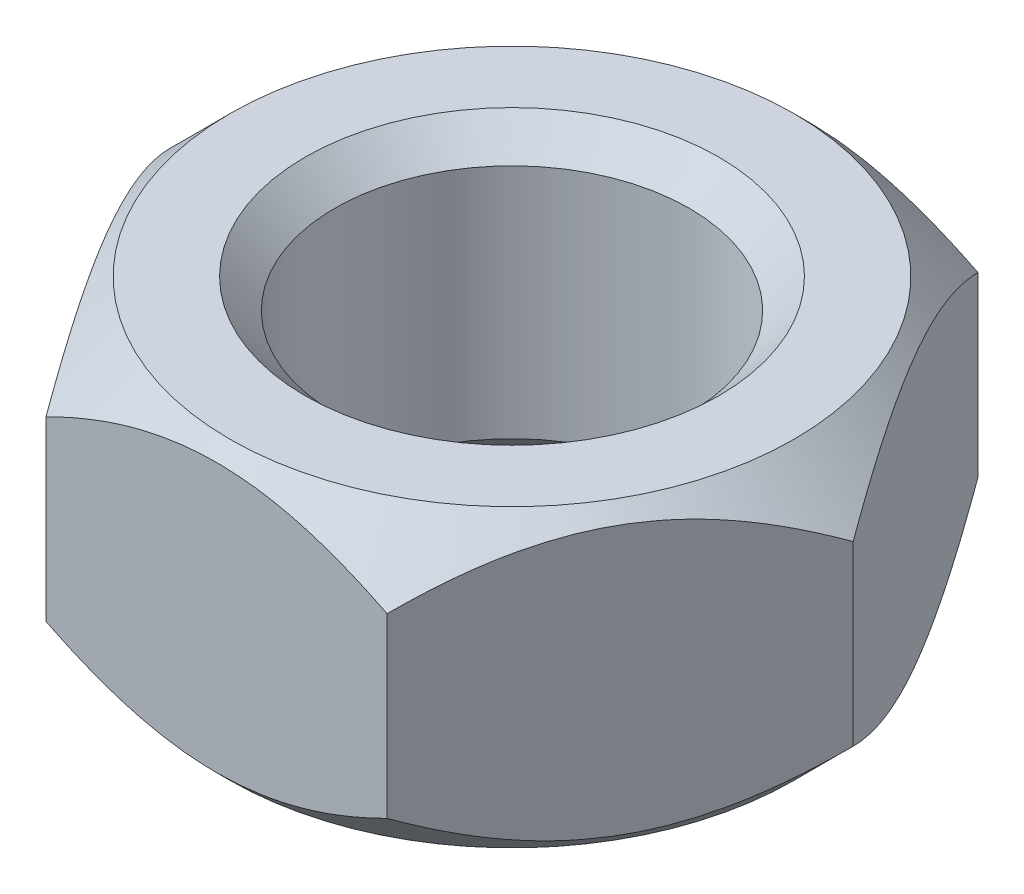
ISO-10303-21;
HEADER;
FILE_DESCRIPTION(('STEP AP214'),'2;1');
FILE_NAME('part.step','',(''),(''),'','','');
FILE_SCHEMA(('AUTOMOTIVE_DESIGN { 1 0 10303 214 1 1 1 1 }'));
ENDSEC;
DATA;
#1=APPLICATION_CONTEXT('core data for automotive mechanical design processes');
#2=APPLICATION_PROTOCOL_DEFINITION('international standard','automotive_design',2000,#1);
#3=PRODUCT_CONTEXT('',#1,'mechanical');
#4=PRODUCT('Part','Part','',(#3));
#5=PRODUCT_RELATED_PRODUCT_CATEGORY('part','',(#4));
#6=PRODUCT_DEFINITION_FORMATION('','',#4);
#7=PRODUCT_DEFINITION_CONTEXT('part definition',#1,'design');
#8=PRODUCT_DEFINITION('design','',#6,#7);
#9=PRODUCT_DEFINITION_SHAPE('','',#8);
#10=(LENGTH_UNIT() NAMED_UNIT(*) SI_UNIT(.MILLI.,.METRE.));
#11=(NAMED_UNIT(*) PLANE_ANGLE_UNIT() SI_UNIT($,.RADIAN.));
#12=(NAMED_UNIT(*) SI_UNIT($,.STERADIAN.) SOLID_ANGLE_UNIT());
#13=UNCERTAINTY_MEASURE_WITH_UNIT(LENGTH_MEASURE(1.E-05),#10,'distance_accuracy_value','');
#14=(GEOMETRIC_REPRESENTATION_CONTEXT(3) GLOBAL_UNCERTAINTY_ASSIGNED_CONTEXT((#13)) GLOBAL_UNIT_ASSIGNED_CONTEXT((#10,
#11,#12)) REPRESENTATION_CONTEXT('',''));
#15=CARTESIAN_POINT('',(0.,0.,0.));
#16=DIRECTION('',(0.,0.,1.));
#17=DIRECTION('',(1.,0.,0.));
#18=AXIS2_PLACEMENT_3D('',#15,#16,#17);
#19=CARTESIAN_POINT('',(-5.77350269189627,-5.,0.));
#20=DIRECTION('',(-0.86602540378444,0.,-0.499999999999998));
#21=DIRECTION('',(-0.499999999999998,0.,0.86602540378444));
#22=AXIS2_PLACEMENT_3D('',#19,#20,#21);
#23=PLANE('',#22);
#24=CARTESIAN_POINT('',(-5.77361816195011,-3.99988452648213,0.000200000000033862));
#25=CARTESIAN_POINT('',(-5.72398176110227,-4.04951645439574,-0.085772768173274));
#26=CARTESIAN_POINT('',(-5.67396382807172,-4.0976252747131,-0.172406369471776));
#27=CARTESIAN_POINT('',(-5.57309004377305,-4.19033336867022,-0.347124889028807));
#28=CARTESIAN_POINT('',(-5.52223375293571,-4.23493072549852,-0.435210568643578));
#29=CARTESIAN_POINT('',(-5.36782257743901,-4.36314092787175,-0.702658569860301));
#30=CARTESIAN_POINT('',(-5.26296050943973,-4.44062493449849,-0.884284999421801));
#31=CARTESIAN_POINT('',(-5.05149774994708,-4.57331105557449,-1.2505492427718));
#32=CARTESIAN_POINT('',(-4.94495110937144,-4.62884745935417,-1.43509343762458));
#33=CARTESIAN_POINT('',(-4.78337944338748,-4.69308950595249,-1.71494377217235));
#34=CARTESIAN_POINT('',(-4.72928433986569,-4.71131783666137,-1.80863923991278));
#35=CARTESIAN_POINT('',(-4.62063609179561,-4.74100781287389,-1.99682352572351));
#36=CARTESIAN_POINT('',(-4.56608301694087,-4.75247046969493,-2.09131222308103));
#37=CARTESIAN_POINT('',(-4.43314578685874,-4.77168913825403,-2.32156625980076));
#38=CARTESIAN_POINT('',(-4.35461839928599,-4.7757217117403,-2.45757968486241));
#39=CARTESIAN_POINT('',(-4.19770514602326,-4.7689541458947,-2.72936141189438));
#40=CARTESIAN_POINT('',(-4.1193193395861,-4.75814880702901,-2.8651296112358));
#41=CARTESIAN_POINT('',(-3.96328672226452,-4.72234235010198,-3.13538603207473));
#42=CARTESIAN_POINT('',(-3.88564083675505,-4.69732535604175,-3.26987265077582));
#43=CARTESIAN_POINT('',(-3.73168360440636,-4.63445567501058,-3.53653439939644));
#44=CARTESIAN_POINT('',(-3.65537215571137,-4.59660397223245,-3.66870970573535));
#45=CARTESIAN_POINT('',(-3.51990355411978,-4.51873011323948,-3.90334820652229));
#46=CARTESIAN_POINT('',(-3.46044647368861,-4.480755749581,-4.00633089069878));
#47=CARTESIAN_POINT('',(-3.34259967462163,-4.39868737382607,-4.21044753419216));
#48=CARTESIAN_POINT('',(-3.28420998845895,-4.35459317589646,-4.31158143726391));
#49=CARTESIAN_POINT('',(-3.16868188148909,-4.26127361464765,-4.51168198823797));
#50=CARTESIAN_POINT('',(-3.11154017495449,-4.21206438729062,-4.61065432718708));
#51=CARTESIAN_POINT('',(-2.99831490663732,-4.109160877157,-4.80676624461304));
#52=CARTESIAN_POINT('',(-2.9422307213283,-4.05546934545099,-4.90390690306938));
#53=CARTESIAN_POINT('',(-2.8866358758943,-3.99988452648214,-5.0002));
#54=B_SPLINE_CURVE_WITH_KNOTS('',3,(#24,#25,#26,#27,#28,#29,#30,#31,#32,#33,#34,#35,#36,#37,#38,
#39,#40,#41,#42,#43,#44,#45,#46,#47,#48,#49,#50,#51,#52,#53),.UNSPECIFIED.,.F.,.F.,(4,2,2,2,2,2,
2,2,2,2,2,2,2,2,4),(0.,0.33294561620957,0.666071736106995,1.33592065243335,1.99513262597483,
2.32409207808826,2.65300234563692,3.12358963991985,3.59434188052355,4.06562104077028,
4.53686407049612,4.91117956742318,5.28550643319672,5.65868635377118,6.03163889109476),.UNSPECIFIED.);
#55=CARTESIAN_POINT('',(-5.77350269189627,-4.,0.));
#56=VERTEX_POINT('',#55);
#57=CARTESIAN_POINT('',(-2.88675134594815,-4.,-5.));
#58=VERTEX_POINT('',#57);
#59=EDGE_CURVE('E156',#56,#58,#54,.T.);
#60=ORIENTED_EDGE('',*,*,#59,.F.);
#61=DIRECTION('',(0.,1.,0.));
#62=VECTOR('',#61,1.);
#63=CARTESIAN_POINT('',(-5.77350269189627,-5.,0.));
#64=LINE('',#63,#62);
#65=CARTESIAN_POINT('',(-5.77350269189627,-1.,0.));
#66=VERTEX_POINT('',#65);
#67=EDGE_CURVE('E52',#56,#66,#64,.T.);
#68=ORIENTED_EDGE('',*,*,#67,.T.);
#69=CARTESIAN_POINT('',(-2.8866358758943,-1.00011547351786,-5.0002));
#70=CARTESIAN_POINT('',(-2.93627227674214,-0.950483545604252,-4.91422723182669));
#71=CARTESIAN_POINT('',(-2.98629020977269,-0.902374725286896,-4.82759363052819));
#72=CARTESIAN_POINT('',(-3.08716399407136,-0.809666631329771,-4.65287511097116));
#73=CARTESIAN_POINT('',(-3.13802028490869,-0.765069274501478,-4.56478943135639));
#74=CARTESIAN_POINT('',(-3.2924314604054,-0.636859072128247,-4.29734143013967));
#75=CARTESIAN_POINT('',(-3.39729352840468,-0.559375065501511,-4.11571500057817));
#76=CARTESIAN_POINT('',(-3.60875628789733,-0.426688944425507,-3.74945075722818));
#77=CARTESIAN_POINT('',(-3.71530292847297,-0.371152540645827,-3.56490656237539));
#78=CARTESIAN_POINT('',(-3.87687459445693,-0.306910494047508,-3.28505622782762));
#79=CARTESIAN_POINT('',(-3.93096969797871,-0.288682163338627,-3.1913607600872));
#80=CARTESIAN_POINT('',(-4.03961794604879,-0.258992187126111,-3.00317647427647));
#81=CARTESIAN_POINT('',(-4.09417102090353,-0.247529530305074,-2.90868777691895));
#82=CARTESIAN_POINT('',(-4.22710825098566,-0.228310861745971,-2.67843374019922));
#83=CARTESIAN_POINT('',(-4.30563563855841,-0.224278288259701,-2.54242031513757));
#84=CARTESIAN_POINT('',(-4.46254889182114,-0.231045854105299,-2.2706385881056));
#85=CARTESIAN_POINT('',(-4.5409346982583,-0.241851192970986,-2.13487038876418));
#86=CARTESIAN_POINT('',(-4.69696731557988,-0.277657649898026,-1.86461396792525));
#87=CARTESIAN_POINT('',(-4.77461320108935,-0.30267464395825,-1.73012734922416));
#88=CARTESIAN_POINT('',(-4.92857043343805,-0.365544324989421,-1.46346560060354));
#89=CARTESIAN_POINT('',(-5.00488188213303,-0.403396027767547,-1.33129029426463));
#90=CARTESIAN_POINT('',(-5.14035048372463,-0.481269886760525,-1.09665179347769));
#91=CARTESIAN_POINT('',(-5.19980756415579,-0.519244250419006,-0.993669109301201));
#92=CARTESIAN_POINT('',(-5.31765436322278,-0.601312626173936,-0.789552465807819));
#93=CARTESIAN_POINT('',(-5.37604404938545,-0.645406824103543,-0.688418562736068));
#94=CARTESIAN_POINT('',(-5.49157215635532,-0.738726385352353,-0.488318011762007));
#95=CARTESIAN_POINT('',(-5.54871386288992,-0.787935612709386,-0.389345672812888));
#96=CARTESIAN_POINT('',(-5.66193913120709,-0.890839122843004,-0.19323375538693));
#97=CARTESIAN_POINT('',(-5.71802331651611,-0.94453065454902,-0.0960930969305876));
#98=CARTESIAN_POINT('',(-5.77361816195011,-1.00011547351787,0.00020000000003385));
#99=B_SPLINE_CURVE_WITH_KNOTS('',3,(#69,#70,#71,#72,#73,#74,#75,#76,#77,#78,#79,#80,#81,#82,#83,
#84,#85,#86,#87,#88,#89,#90,#91,#92,#93,#94,#95,#96,#97,#98),.UNSPECIFIED.,.F.,.F.,(4,2,2,2,2,2,
2,2,2,2,2,2,2,2,4),(0.,0.332945616209568,0.666071736106989,1.33592065243334,1.99513262597481,
2.32409207808824,2.65300234563691,3.12358963991983,3.59434188052353,4.06562104077026,
4.5368640704961,4.91117956742317,5.28550643319671,5.65868635377117,6.03163889109476),.UNSPECIFIED.);
#100=CARTESIAN_POINT('',(-2.88675134594815,-1.,-5.));
#101=VERTEX_POINT('',#100);
#102=EDGE_CURVE('E112',#101,#66,#99,.T.);
#103=ORIENTED_EDGE('',*,*,#102,.F.);
#104=DIRECTION('',(0.,1.,0.));
#105=VECTOR('',#104,1.);
#106=CARTESIAN_POINT('',(-2.88675134594814,-5.,-5.));
#107=LINE('',#106,#105);
#108=EDGE_CURVE('E117',#58,#101,#107,.T.);
#109=ORIENTED_EDGE('',*,*,#108,.F.);
#110=EDGE_LOOP('',(#60,#68,#103,#109));
#111=FACE_BOUND('',#110,.T.);
#112=ADVANCED_FACE('F29',(#111),#23,.T.);
#113=CARTESIAN_POINT('',(-2.88675134594814,-5.,-5.));
#114=DIRECTION('',(0.,0.,-1.));
#115=DIRECTION('',(-1.,0.,0.));
#116=AXIS2_PLACEMENT_3D('',#113,#114,#115);
#117=PLANE('',#116);
#118=CARTESIAN_POINT('',(-5.93336867910427,-2.01432336144028,-5.));
#119=CARTESIAN_POINT('',(-5.78966341948591,-2.12418858178788,-5.));
#120=CARTESIAN_POINT('',(-5.64517359422459,-2.23304389822758,-5.));
#121=CARTESIAN_POINT('',(-5.35430787651164,-2.44827641705776,-5.));
#122=CARTESIAN_POINT('',(-5.2079315372339,-2.55465301495843,-5.));
#123=CARTESIAN_POINT('',(-4.91190536107514,-2.76522692025995,-5.));
#124=CARTESIAN_POINT('',(-4.76223896743824,-2.86940102910426,-5.));
#125=CARTESIAN_POINT('',(-4.46039793019073,-3.07403749362641,-5.));
#126=CARTESIAN_POINT('',(-4.30822346176154,-3.17450010696542,-5.));
#127=CARTESIAN_POINT('',(-3.99153933620169,-3.37689028562684,-5.));
#128=CARTESIAN_POINT('',(-3.82684512877717,-3.47853053625135,-5.));
#129=CARTESIAN_POINT('',(-3.49359569305954,-3.67537782448447,-5.));
#130=CARTESIAN_POINT('',(-3.32503983391763,-3.77058380079454,-5.));
#131=CARTESIAN_POINT('',(-2.98404180965615,-3.95252582018176,-5.));
#132=CARTESIAN_POINT('',(-2.81161302726994,-4.03928674909056,-5.));
#133=CARTESIAN_POINT('',(-2.46193775088612,-4.20239520740955,-5.));
#134=CARTESIAN_POINT('',(-2.2846935457348,-4.27874758379917,-5.));
#135=CARTESIAN_POINT('',(-1.94171568558996,-4.41181755173879,-5.));
#136=CARTESIAN_POINT('',(-1.77643834256963,-4.46969922851382,-5.));
#137=CARTESIAN_POINT('',(-1.44175059438625,-4.57222452709262,-5.));
#138=CARTESIAN_POINT('',(-1.27233991994474,-4.61686728390092,-5.));
#139=CARTESIAN_POINT('',(-0.933301891878306,-4.6897843558899,-5.));
#140=CARTESIAN_POINT('',(-0.763738295172403,-4.71835018807338,-5.));
#141=CARTESIAN_POINT('',(-0.42260345866771,-4.75853073066783,-5.));
#142=CARTESIAN_POINT('',(-0.25103261659064,-4.77014874369411,-5.));
#143=CARTESIAN_POINT('',(0.0853406388539533,-4.77548648250808,-5.));
#144=CARTESIAN_POINT('',(0.250131876658646,-4.76992113564034,-5.));
#145=CARTESIAN_POINT('',(0.578387101858164,-4.74282076274747,-5.));
#146=CARTESIAN_POINT('',(0.741850964252605,-4.72128424993437,-5.));
#147=CARTESIAN_POINT('',(1.06903592592894,-4.66307865086046,-5.));
#148=CARTESIAN_POINT('',(1.23270929845992,-4.6261457054463,-5.));
#149=CARTESIAN_POINT('',(1.55646565066118,-4.53916921466345,-5.));
#150=CARTESIAN_POINT('',(1.71654886698276,-4.48912653621914,-5.));
#151=CARTESIAN_POINT('',(2.04376834721888,-4.37425220624935,-5.));
#152=CARTESIAN_POINT('',(2.21062650526837,-4.30863700466565,-5.));
#153=CARTESIAN_POINT('',(2.54003854131556,-4.16728810798753,-5.));
#154=CARTESIAN_POINT('',(2.7025904176521,-4.09154980299361,-5.));
#155=CARTESIAN_POINT('',(3.02416565802373,-3.93175240216771,-5.));
#156=CARTESIAN_POINT('',(3.1831761026048,-3.84766751767456,-5.));
#157=CARTESIAN_POINT('',(3.49754870709799,-3.6730298715177,-5.));
#158=CARTESIAN_POINT('',(3.65291142946938,-3.58247811583028,-5.));
#159=CARTESIAN_POINT('',(3.95285892432342,-3.40078159251412,-5.));
#160=CARTESIAN_POINT('',(4.09759659911004,-3.30988790532248,-5.));
#161=CARTESIAN_POINT('',(4.38458573992775,-3.12424528238797,-5.));
#162=CARTESIAN_POINT('',(4.52683701776729,-3.02949605661617,-5.));
#163=CARTESIAN_POINT('',(4.80803186770968,-2.83760520698688,-5.));
#164=CARTESIAN_POINT('',(4.94699285705845,-2.74048901451516,-5.));
#165=CARTESIAN_POINT('',(5.22301057132509,-2.54366358089935,-5.));
#166=CARTESIAN_POINT('',(5.36006781033933,-2.44395506153837,-5.));
#167=CARTESIAN_POINT('',(5.49632687048857,-2.34318580314552,-5.));
#168=B_SPLINE_CURVE_WITH_KNOTS('',3,(#118,#119,#120,#121,#122,#123,#124,#125,#126,#127,#128,
#129,#130,#131,#132,#133,#134,#135,#136,#137,#138,#139,#140,#141,#142,#143,#144,#145,#146,#147,
#148,#149,#150,#151,#152,#153,#154,#155,#156,#157,#158,#159,#160,#161,#162,#163,#164,#165,#166,
#167),.UNSPECIFIED.,.F.,.F.,(4,2,2,2,2,2,2,2,2,2,2,2,2,2,2,2,2,2,2,2,2,2,2,2,4),(0.,
0.542683335711667,1.08549766009345,1.63250741832323,2.17947913015189,2.75996048819958,
3.34053736097751,3.91934802264127,4.49788822043798,5.02279153401115,5.54772913580439,
6.06281331680066,6.57779711011596,7.07164749903815,7.56554386725877,8.06827708076717,
8.57097705777065,9.10845041736524,9.64616937298296,10.1856047538603,10.7249564030361,
11.2376185039343,11.7503192408631,12.2588884723275,12.7673175877715),.UNSPECIFIED.);
#169=CARTESIAN_POINT('',(2.88675134594812,-4.,-5.00000000000002));
#170=VERTEX_POINT('',#169);
#171=EDGE_CURVE('E159',#58,#170,#168,.T.);
#172=ORIENTED_EDGE('',*,*,#171,.F.);
#173=ORIENTED_EDGE('',*,*,#108,.T.);
#174=CARTESIAN_POINT('',(-5.93336867910427,-2.98567663855972,-5.));
#175=CARTESIAN_POINT('',(-5.78966341948591,-2.87581141821212,-5.));
#176=CARTESIAN_POINT('',(-5.64517359422459,-2.76695610177242,-5.));
#177=CARTESIAN_POINT('',(-5.35430787651164,-2.55172358294224,-5.));
#178=CARTESIAN_POINT('',(-5.2079315372339,-2.44534698504157,-5.));
#179=CARTESIAN_POINT('',(-4.91190536107514,-2.23477307974005,-5.));
#180=CARTESIAN_POINT('',(-4.76223896743824,-2.13059897089574,-5.));
#181=CARTESIAN_POINT('',(-4.46039793019073,-1.92596250637359,-5.));
#182=CARTESIAN_POINT('',(-4.30822346176154,-1.82549989303458,-5.));
#183=CARTESIAN_POINT('',(-3.99153933620169,-1.62310971437316,-5.));
#184=CARTESIAN_POINT('',(-3.82684512877717,-1.52146946374865,-5.));
#185=CARTESIAN_POINT('',(-3.49359569305954,-1.32462217551553,-5.));
#186=CARTESIAN_POINT('',(-3.32503983391763,-1.22941619920546,-5.));
#187=CARTESIAN_POINT('',(-2.98404180965615,-1.04747417981824,-5.));
#188=CARTESIAN_POINT('',(-2.81161302726994,-0.960713250909444,-5.));
#189=CARTESIAN_POINT('',(-2.46193775088612,-0.797604792590446,-5.));
#190=CARTESIAN_POINT('',(-2.2846935457348,-0.721252416200831,-5.));
#191=CARTESIAN_POINT('',(-1.94171568558996,-0.58818244826121,-5.));
#192=CARTESIAN_POINT('',(-1.77643834256963,-0.530300771486182,-5.));
#193=CARTESIAN_POINT('',(-1.44175059438625,-0.427775472907381,-5.));
#194=CARTESIAN_POINT('',(-1.27233991994474,-0.383132716099075,-5.));
#195=CARTESIAN_POINT('',(-0.933301891878305,-0.310215644110102,-5.));
#196=CARTESIAN_POINT('',(-0.763738295172403,-0.281649811926615,-5.));
#197=CARTESIAN_POINT('',(-0.42260345866771,-0.241469269332174,-5.));
#198=CARTESIAN_POINT('',(-0.25103261659064,-0.229851256305893,-5.));
#199=CARTESIAN_POINT('',(0.0853406388539528,-0.224513517491921,-5.));
#200=CARTESIAN_POINT('',(0.250131876658645,-0.230078864359664,-5.));
#201=CARTESIAN_POINT('',(0.578387101858163,-0.257179237252532,-5.));
#202=CARTESIAN_POINT('',(0.741850964252604,-0.278715750065631,-5.));
#203=CARTESIAN_POINT('',(1.06903592592894,-0.336921349139542,-5.));
#204=CARTESIAN_POINT('',(1.23270929845992,-0.373854294553702,-5.));
#205=CARTESIAN_POINT('',(1.55646565066118,-0.460830785336546,-5.));
#206=CARTESIAN_POINT('',(1.71654886698276,-0.510873463780861,-5.));
#207=CARTESIAN_POINT('',(2.04376834721888,-0.625747793750653,-5.));
#208=CARTESIAN_POINT('',(2.21062650526837,-0.691362995334349,-5.));
#209=CARTESIAN_POINT('',(2.54003854131556,-0.83271189201247,-5.));
#210=CARTESIAN_POINT('',(2.7025904176521,-0.908450197006386,-5.));
#211=CARTESIAN_POINT('',(3.02416565802373,-1.06824759783229,-5.));
#212=CARTESIAN_POINT('',(3.1831761026048,-1.15233248232544,-5.));
#213=CARTESIAN_POINT('',(3.49754870709799,-1.3269701284823,-5.));
#214=CARTESIAN_POINT('',(3.65291142946938,-1.41752188416972,-5.));
#215=CARTESIAN_POINT('',(3.95285892432342,-1.59921840748588,-5.));
#216=CARTESIAN_POINT('',(4.09759659911004,-1.69011209467752,-5.));
#217=CARTESIAN_POINT('',(4.38458573992775,-1.87575471761203,-5.));
#218=CARTESIAN_POINT('',(4.52683701776729,-1.97050394338384,-5.));
#219=CARTESIAN_POINT('',(4.80803186770969,-2.16239479301312,-5.));
#220=CARTESIAN_POINT('',(4.94699285705845,-2.25951098548484,-5.));
#221=CARTESIAN_POINT('',(5.22301057132509,-2.45633641910065,-5.));
#222=CARTESIAN_POINT('',(5.36006781033933,-2.55604493846163,-5.));
#223=CARTESIAN_POINT('',(5.49632687048857,-2.65681419685448,-5.));
#224=B_SPLINE_CURVE_WITH_KNOTS('',3,(#174,#175,#176,#177,#178,#179,#180,#181,#182,#183,#184,
#185,#186,#187,#188,#189,#190,#191,#192,#193,#194,#195,#196,#197,#198,#199,#200,#201,#202,#203,
#204,#205,#206,#207,#208,#209,#210,#211,#212,#213,#214,#215,#216,#217,#218,#219,#220,#221,#222,
#223),.UNSPECIFIED.,.F.,.F.,(4,2,2,2,2,2,2,2,2,2,2,2,2,2,2,2,2,2,2,2,2,2,2,2,4),(0.,
0.542683335711667,1.08549766009345,1.63250741832323,2.1794791301519,2.75996048819958,
3.34053736097751,3.91934802264127,4.49788822043798,5.02279153401115,5.5477291358044,
6.06281331680067,6.57779711011596,7.07164749903815,7.56554386725878,8.06827708076717,
8.57097705777065,9.10845041736524,9.64616937298296,10.1856047538603,10.7249564030361,
11.2376185039343,11.7503192408631,12.2588884723275,12.7673175877715),.UNSPECIFIED.);
#225=CARTESIAN_POINT('',(2.88675134594812,-1.,-5.00000000000002));
#226=VERTEX_POINT('',#225);
#227=EDGE_CURVE('E203',#226,#101,#224,.F.);
#228=ORIENTED_EDGE('',*,*,#227,.F.);
#229=DIRECTION('',(0.,1.,0.));
#230=VECTOR('',#229,1.);
#231=CARTESIAN_POINT('',(2.88675134594813,-5.,-5.));
#232=LINE('',#231,#230);
#233=EDGE_CURVE('E106',#170,#226,#232,.T.);
#234=ORIENTED_EDGE('',*,*,#233,.F.);
#235=EDGE_LOOP('',(#172,#173,#228,#234));
#236=FACE_BOUND('',#235,.T.);
#237=ADVANCED_FACE('F148',(#236),#117,.T.);
#238=CARTESIAN_POINT('',(2.88675134594813,-5.,-5.));
#239=DIRECTION('',(0.866025403784439,0.,-0.5));
#240=DIRECTION('',(-0.5,0.,-0.866025403784439));
#241=AXIS2_PLACEMENT_3D('',#238,#239,#240);
#242=PLANE('',#241);
#243=CARTESIAN_POINT('',(2.88663587589429,-3.99988452648214,-5.0002));
#244=CARTESIAN_POINT('',(2.93627227674213,-4.04951645439575,-4.91422723182669));
#245=CARTESIAN_POINT('',(2.98629020977268,-4.09762527471311,-4.82759363052819));
#246=CARTESIAN_POINT('',(3.08716399407135,-4.19033336867023,-4.65287511097116));
#247=CARTESIAN_POINT('',(3.13802028490869,-4.23493072549853,-4.56478943135639));
#248=CARTESIAN_POINT('',(3.29243146040539,-4.36314092787176,-4.29734143013967));
#249=CARTESIAN_POINT('',(3.39729352840467,-4.44062493449849,-4.11571500057817));
#250=CARTESIAN_POINT('',(3.60875628789732,-4.5733110555745,-3.74945075722818));
#251=CARTESIAN_POINT('',(3.71530292847296,-4.62884745935418,-3.5649065623754));
#252=CARTESIAN_POINT('',(3.87687459445692,-4.69308950595249,-3.28505622782763));
#253=CARTESIAN_POINT('',(3.9309696979787,-4.71131783666137,-3.19136076008721));
#254=CARTESIAN_POINT('',(4.03961794604878,-4.74100781287389,-3.00317647427647));
#255=CARTESIAN_POINT('',(4.09417102090353,-4.75247046969493,-2.90868777691895));
#256=CARTESIAN_POINT('',(4.22710825098566,-4.77168913825403,-2.67843374019923));
#257=CARTESIAN_POINT('',(4.3056356385584,-4.7757217117403,-2.54242031513758));
#258=CARTESIAN_POINT('',(4.46254889182113,-4.7689541458947,-2.27063858810561));
#259=CARTESIAN_POINT('',(4.54093469825829,-4.75814880702902,-2.13487038876419));
#260=CARTESIAN_POINT('',(4.69696731557988,-4.72234235010198,-1.86461396792525));
#261=CARTESIAN_POINT('',(4.77461320108935,-4.69732535604175,-1.73012734922417));
#262=CARTESIAN_POINT('',(4.92857043343804,-4.63445567501058,-1.46346560060355));
#263=CARTESIAN_POINT('',(5.00488188213303,-4.59660397223245,-1.33129029426464));
#264=CARTESIAN_POINT('',(5.14035048372462,-4.51873011323948,-1.0966517934777));
#265=CARTESIAN_POINT('',(5.19980756415579,-4.480755749581,-0.993669109301211));
#266=CARTESIAN_POINT('',(5.31765436322277,-4.39868737382607,-0.789552465807831));
#267=CARTESIAN_POINT('',(5.37604404938545,-4.35459317589646,-0.688418562736081));
#268=CARTESIAN_POINT('',(5.49157215635531,-4.26127361464765,-0.48831801176202));
#269=CARTESIAN_POINT('',(5.54871386288991,-4.21206438729062,-0.389345672812902));
#270=CARTESIAN_POINT('',(5.66193913120708,-4.109160877157,-0.193233755386945));
#271=CARTESIAN_POINT('',(5.71802331651611,-4.05546934545099,-0.0960930969306035));
#272=CARTESIAN_POINT('',(5.7736181619501,-3.99988452648213,0.000200000000016208));
#273=B_SPLINE_CURVE_WITH_KNOTS('',3,(#243,#244,#245,#246,#247,#248,#249,#250,#251,#252,#253,
#254,#255,#256,#257,#258,#259,#260,#261,#262,#263,#264,#265,#266,#267,#268,#269,#270,#271,#272),
.UNSPECIFIED.,.F.,.F.,(4,2,2,2,2,2,2,2,2,2,2,2,2,2,4),(0.,0.332945616209567,0.666071736106989,
1.33592065243334,1.99513262597481,2.32409207808823,2.6530023456369,3.12358963991982,
3.59434188052352,4.06562104077025,4.53686407049609,4.91117956742316,5.2855064331967,
5.65868635377116,6.03163889109474),.UNSPECIFIED.);
#274=CARTESIAN_POINT('',(5.77350269189627,-4.,0.));
#275=VERTEX_POINT('',#274);
#276=EDGE_CURVE('E86',#170,#275,#273,.T.);
#277=ORIENTED_EDGE('',*,*,#276,.F.);
#278=ORIENTED_EDGE('',*,*,#233,.T.);
#279=CARTESIAN_POINT('',(5.7736181619501,-1.00011547351786,0.000200000000017303));
#280=CARTESIAN_POINT('',(5.72398176110227,-0.950483545604256,-0.0857727681732899));
#281=CARTESIAN_POINT('',(5.67396382807171,-0.9023747252869,-0.172406369471792));
#282=CARTESIAN_POINT('',(5.57309004377305,-0.809666631329774,-0.347124889028822));
#283=CARTESIAN_POINT('',(5.52223375293571,-0.765069274501481,-0.435210568643593));
#284=CARTESIAN_POINT('',(5.36782257743901,-0.636859072128248,-0.702658569860314));
#285=CARTESIAN_POINT('',(5.26296050943973,-0.559375065501512,-0.884284999421813));
#286=CARTESIAN_POINT('',(5.05149774994707,-0.426688944425507,-1.25054924277181));
#287=CARTESIAN_POINT('',(4.94495110937143,-0.371152540645827,-1.43509343762459));
#288=CARTESIAN_POINT('',(4.78337944338747,-0.306910494047507,-1.71494377217236));
#289=CARTESIAN_POINT('',(4.72928433986569,-0.288682163338626,-1.80863923991278));
#290=CARTESIAN_POINT('',(4.62063609179561,-0.25899218712611,-1.99682352572352));
#291=CARTESIAN_POINT('',(4.56608301694086,-0.247529530305073,-2.09131222308104));
#292=CARTESIAN_POINT('',(4.43314578685873,-0.22831086174597,-2.32156625980076));
#293=CARTESIAN_POINT('',(4.35461839928599,-0.2242782882597,-2.45757968486242));
#294=CARTESIAN_POINT('',(4.19770514602326,-0.231045854105297,-2.72936141189438));
#295=CARTESIAN_POINT('',(4.1193193395861,-0.241851192970984,-2.86512961123581));
#296=CARTESIAN_POINT('',(3.96328672226452,-0.277657649898024,-3.13538603207474));
#297=CARTESIAN_POINT('',(3.88564083675504,-0.302674643958248,-3.26987265077583));
#298=CARTESIAN_POINT('',(3.73168360440635,-0.36554432498942,-3.53653439939645));
#299=CARTESIAN_POINT('',(3.65537215571136,-0.403396027767546,-3.66870970573535));
#300=CARTESIAN_POINT('',(3.51990355411977,-0.481269886760522,-3.9033482065223));
#301=CARTESIAN_POINT('',(3.4604464736886,-0.519244250419002,-4.00633089069878));
#302=CARTESIAN_POINT('',(3.34259967462162,-0.601312626173931,-4.21044753419216));
#303=CARTESIAN_POINT('',(3.28420998845895,-0.645406824103538,-4.31158143726391));
#304=CARTESIAN_POINT('',(3.16868188148908,-0.738726385352347,-4.51168198823797));
#305=CARTESIAN_POINT('',(3.11154017495448,-0.787935612709378,-4.61065432718708));
#306=CARTESIAN_POINT('',(2.99831490663731,-0.890839122842994,-4.80676624461304));
#307=CARTESIAN_POINT('',(2.94223072132829,-0.944530654549008,-4.90390690306938));
#308=CARTESIAN_POINT('',(2.88663587589429,-1.00011547351786,-5.0002));
#309=B_SPLINE_CURVE_WITH_KNOTS('',3,(#279,#280,#281,#282,#283,#284,#285,#286,#287,#288,#289,
#290,#291,#292,#293,#294,#295,#296,#297,#298,#299,#300,#301,#302,#303,#304,#305,#306,#307,#308),
.UNSPECIFIED.,.F.,.F.,(4,2,2,2,2,2,2,2,2,2,2,2,2,2,4),(0.,0.332945616209569,0.666071736106992,
1.33592065243334,1.99513262597482,2.32409207808825,2.65300234563691,3.12358963991984,
3.59434188052354,4.06562104077027,4.53686407049611,4.91117956742317,5.28550643319671,
5.65868635377116,6.03163889109474),.UNSPECIFIED.);
#310=CARTESIAN_POINT('',(5.77350269189627,-1.,0.));
#311=VERTEX_POINT('',#310);
#312=EDGE_CURVE('E197',#311,#226,#309,.T.);
#313=ORIENTED_EDGE('',*,*,#312,.F.);
#314=DIRECTION('',(0.,1.,0.));
#315=VECTOR('',#314,1.);
#316=CARTESIAN_POINT('',(5.77350269189627,-5.,0.));
#317=LINE('',#316,#315);
#318=EDGE_CURVE('E104',#275,#311,#317,.T.);
#319=ORIENTED_EDGE('',*,*,#318,.F.);
#320=EDGE_LOOP('',(#277,#278,#313,#319));
#321=FACE_BOUND('',#320,.T.);
#322=ADVANCED_FACE('F153',(#321),#242,.T.);
#323=CARTESIAN_POINT('',(5.77350269189627,-5.,0.));
#324=DIRECTION('',(0.866025403784436,0.,0.500000000000005));
#325=DIRECTION('',(0.500000000000005,0.,-0.866025403784436));
#326=AXIS2_PLACEMENT_3D('',#323,#324,#325);
#327=PLANE('',#326);
#328=CARTESIAN_POINT('',(5.7736181619501,-3.99988452648213,-0.000199999999982731));
#329=CARTESIAN_POINT('',(5.72398176110227,-4.04951645439574,0.0857727681733245));
#330=CARTESIAN_POINT('',(5.67396382807171,-4.0976252747131,0.172406369471826));
#331=CARTESIAN_POINT('',(5.57309004377305,-4.19033336867023,0.347124889028856));
#332=CARTESIAN_POINT('',(5.5222337529357,-4.23493072549852,0.435210568643627));
#333=CARTESIAN_POINT('',(5.367822577439,-4.36314092787175,0.702658569860348));
#334=CARTESIAN_POINT('',(5.26296050943972,-4.44062493449849,0.884284999421846));
#335=CARTESIAN_POINT('',(5.05149774994706,-4.57331105557449,1.25054924277184));
#336=CARTESIAN_POINT('',(4.94495110937142,-4.62884745935417,1.43509343762463));
#337=CARTESIAN_POINT('',(4.78337944338746,-4.69308950595249,1.71494377217239));
#338=CARTESIAN_POINT('',(4.72928433986568,-4.71131783666137,1.80863923991282));
#339=CARTESIAN_POINT('',(4.62063609179559,-4.74100781287389,1.99682352572355));
#340=CARTESIAN_POINT('',(4.56608301694085,-4.75247046969493,2.09131222308107));
#341=CARTESIAN_POINT('',(4.43314578685872,-4.77168913825403,2.32156625980079));
#342=CARTESIAN_POINT('',(4.35461839928597,-4.7757217117403,2.45757968486245));
#343=CARTESIAN_POINT('',(4.19770514602324,-4.76895414589471,2.72936141189441));
#344=CARTESIAN_POINT('',(4.11931933958608,-4.75814880702902,2.86512961123583));
#345=CARTESIAN_POINT('',(3.96328672226449,-4.72234235010198,3.13538603207477));
#346=CARTESIAN_POINT('',(3.88564083675502,-4.69732535604175,3.26987265077585));
#347=CARTESIAN_POINT('',(3.73168360440632,-4.63445567501058,3.53653439939647));
#348=CARTESIAN_POINT('',(3.65537215571133,-4.59660397223245,3.66870970573538));
#349=CARTESIAN_POINT('',(3.51990355411974,-4.51873011323948,3.90334820652232));
#350=CARTESIAN_POINT('',(3.46044647368858,-4.480755749581,4.0063308906988));
#351=CARTESIAN_POINT('',(3.34259967462159,-4.39868737382607,4.21044753419218));
#352=CARTESIAN_POINT('',(3.28420998845892,-4.35459317589646,4.31158143726392));
#353=CARTESIAN_POINT('',(3.16868188148906,-4.26127361464766,4.51168198823798));
#354=CARTESIAN_POINT('',(3.11154017495446,-4.21206438729063,4.61065432718709));
#355=CARTESIAN_POINT('',(2.99831490663729,-4.10916087715701,4.80676624461304));
#356=CARTESIAN_POINT('',(2.94223072132827,-4.055469345451,4.90390690306938));
#357=CARTESIAN_POINT('',(2.88663587589427,-3.99988452648215,5.0002));
#358=B_SPLINE_CURVE_WITH_KNOTS('',3,(#328,#329,#330,#331,#332,#333,#334,#335,#336,#337,#338,
#339,#340,#341,#342,#343,#344,#345,#346,#347,#348,#349,#350,#351,#352,#353,#354,#355,#356,#357),
.UNSPECIFIED.,.F.,.F.,(4,2,2,2,2,2,2,2,2,2,2,2,2,2,4),(0.,0.33294561620957,0.666071736106994,
1.33592065243335,1.99513262597482,2.32409207808825,2.65300234563692,3.12358963991984,
3.59434188052354,4.06562104077027,4.53686407049611,4.91117956742317,5.2855064331967,
5.65868635377115,6.03163889109472),.UNSPECIFIED.);
#359=CARTESIAN_POINT('',(2.88675134594815,-4.,5.));
#360=VERTEX_POINT('',#359);
#361=EDGE_CURVE('E82',#275,#360,#358,.T.);
#362=ORIENTED_EDGE('',*,*,#361,.F.);
#363=ORIENTED_EDGE('',*,*,#318,.T.);
#364=CARTESIAN_POINT('',(2.88663587589427,-1.00011547351785,5.0002));
#365=CARTESIAN_POINT('',(2.93627227674211,-0.950483545604238,4.91422723182669));
#366=CARTESIAN_POINT('',(2.98629020977266,-0.902374725286883,4.82759363052819));
#367=CARTESIAN_POINT('',(3.08716399407133,-0.809666631329759,4.65287511097117));
#368=CARTESIAN_POINT('',(3.13802028490867,-0.765069274501467,4.5647894313564));
#369=CARTESIAN_POINT('',(3.29243146040537,-0.636859072128237,4.29734143013968));
#370=CARTESIAN_POINT('',(3.39729352840465,-0.559375065501503,4.11571500057818));
#371=CARTESIAN_POINT('',(3.6087562878973,-0.426688944425501,3.74945075722819));
#372=CARTESIAN_POINT('',(3.71530292847294,-0.371152540645822,3.56490656237541));
#373=CARTESIAN_POINT('',(3.8768745944569,-0.306910494047504,3.28505622782765));
#374=CARTESIAN_POINT('',(3.93096969797868,-0.288682163338624,3.19136076008722));
#375=CARTESIAN_POINT('',(4.03961794604877,-0.258992187126108,3.00317647427649));
#376=CARTESIAN_POINT('',(4.09417102090351,-0.247529530305072,2.90868777691897));
#377=CARTESIAN_POINT('',(4.22710825098564,-0.228310861745969,2.67843374019925));
#378=CARTESIAN_POINT('',(4.30563563855839,-0.224278288259699,2.5424203151376));
#379=CARTESIAN_POINT('',(4.46254889182112,-0.231045854105296,2.27063858810564));
#380=CARTESIAN_POINT('',(4.54093469825828,-0.241851192970983,2.13487038876421));
#381=CARTESIAN_POINT('',(4.69696731557987,-0.277657649898024,1.86461396792528));
#382=CARTESIAN_POINT('',(4.77461320108934,-0.302674643958249,1.7301273492242));
#383=CARTESIAN_POINT('',(4.92857043343803,-0.36554432498942,1.46346560060358));
#384=CARTESIAN_POINT('',(5.00488188213302,-0.403396027767546,1.33129029426467));
#385=CARTESIAN_POINT('',(5.14035048372462,-0.481269886760524,1.09665179347773));
#386=CARTESIAN_POINT('',(5.19980756415578,-0.519244250419005,0.993669109301242));
#387=CARTESIAN_POINT('',(5.31765436322277,-0.601312626173935,0.789552465807862));
#388=CARTESIAN_POINT('',(5.37604404938544,-0.645406824103542,0.688418562736112));
#389=CARTESIAN_POINT('',(5.49157215635531,-0.738726385352351,0.488318011762052));
#390=CARTESIAN_POINT('',(5.54871386288991,-0.787935612709383,0.389345672812934));
#391=CARTESIAN_POINT('',(5.66193913120708,-0.890839122843001,0.193233755386978));
#392=CARTESIAN_POINT('',(5.71802331651611,-0.944530654549016,0.0960930969306369));
#393=CARTESIAN_POINT('',(5.7736181619501,-1.00011547351787,-0.000199999999982832));
#394=B_SPLINE_CURVE_WITH_KNOTS('',3,(#364,#365,#366,#367,#368,#369,#370,#371,#372,#373,#374,
#375,#376,#377,#378,#379,#380,#381,#382,#383,#384,#385,#386,#387,#388,#389,#390,#391,#392,#393),
.UNSPECIFIED.,.F.,.F.,(4,2,2,2,2,2,2,2,2,2,2,2,2,2,4),(0.,0.332945616209565,0.666071736106984,
1.33592065243333,1.99513262597479,2.32409207808822,2.65300234563688,3.1235896399198,
3.5943418805235,4.06562104077023,4.53686407049607,4.91117956742314,5.28550643319668,
5.65868635377114,6.03163889109472),.UNSPECIFIED.);
#395=CARTESIAN_POINT('',(2.88675134594815,-1.,5.));
#396=VERTEX_POINT('',#395);
#397=EDGE_CURVE('E103',#396,#311,#394,.T.);
#398=ORIENTED_EDGE('',*,*,#397,.F.);
#399=DIRECTION('',(0.,1.,0.));
#400=VECTOR('',#399,1.);
#401=CARTESIAN_POINT('',(2.88675134594811,-5.,5.));
#402=LINE('',#401,#400);
#403=EDGE_CURVE('E95',#360,#396,#402,.T.);
#404=ORIENTED_EDGE('',*,*,#403,.F.);
#405=EDGE_LOOP('',(#362,#363,#398,#404));
#406=FACE_BOUND('',#405,.T.);
#407=ADVANCED_FACE('F101',(#406),#327,.T.);
#408=CARTESIAN_POINT('',(2.88675134594811,-5.,5.));
#409=DIRECTION('',(0.,0.,1.));
#410=DIRECTION('',(1.,0.,0.));
#411=AXIS2_PLACEMENT_3D('',#408,#409,#410);
#412=PLANE('',#411);
#413=CARTESIAN_POINT('',(-5.93336867913979,-2.01432336141311,5.));
#414=CARTESIAN_POINT('',(-5.78966341952042,-2.12418858176176,5.));
#415=CARTESIAN_POINT('',(-5.64517359425807,-2.23304389820251,5.));
#416=CARTESIAN_POINT('',(-5.35430787654308,-2.44827641703478,5.));
#417=CARTESIAN_POINT('',(-5.20793153726431,-2.5546530149365,5.));
#418=CARTESIAN_POINT('',(-4.91190536110345,-2.76522692024011,5.));
#419=CARTESIAN_POINT('',(-4.76223896746549,-2.86940102908547,5.));
#420=CARTESIAN_POINT('',(-4.46039793021584,-3.0740374936097,5.));
#421=CARTESIAN_POINT('',(-4.30822346178556,-3.17450010694974,5.));
#422=CARTESIAN_POINT('',(-3.99153933622338,-3.37689028561333,5.));
#423=CARTESIAN_POINT('',(-3.82684512879759,-3.47853053623895,5.));
#424=CARTESIAN_POINT('',(-3.49359569307741,-3.67537782447425,5.));
#425=CARTESIAN_POINT('',(-3.3250398339342,-3.77058380078538,5.));
#426=CARTESIAN_POINT('',(-2.98404180967007,-3.95252582017465,5.));
#427=CARTESIAN_POINT('',(-2.81161302728251,-4.03928674908442,5.));
#428=CARTESIAN_POINT('',(-2.46193775089592,-4.20239520740525,5.));
#429=CARTESIAN_POINT('',(-2.28469354574318,-4.27874758379572,5.));
#430=CARTESIAN_POINT('',(-1.94171568559774,-4.41181755173595,5.));
#431=CARTESIAN_POINT('',(-1.7764383425783,-4.46969922851089,5.));
#432=CARTESIAN_POINT('',(-1.44175059439672,-4.57222452708969,5.));
#433=CARTESIAN_POINT('',(-1.27233991995613,-4.61686728389808,5.));
#434=CARTESIAN_POINT('',(-0.933301891891501,-4.68978435588744,5.));
#435=CARTESIAN_POINT('',(-0.763738295186488,-4.71835018807123,5.));
#436=CARTESIAN_POINT('',(-0.422603458683547,-4.75853073066646,5.));
#437=CARTESIAN_POINT('',(-0.251032616607341,-4.77014874369324,5.));
#438=CARTESIAN_POINT('',(0.0853406388357414,-4.77548648250837,5.));
#439=CARTESIAN_POINT('',(0.250131876639784,-4.76992113564126,5.));
#440=CARTESIAN_POINT('',(0.578387101838071,-4.74282076274976,5.));
#441=CARTESIAN_POINT('',(0.741850964231933,-4.72128424993739,5.));
#442=CARTESIAN_POINT('',(1.06903592590712,-4.66307865086501,5.));
#443=CARTESIAN_POINT('',(1.23270929843754,-4.62614570545165,5.));
#444=CARTESIAN_POINT('',(1.55646565063773,-4.53916921467042,5.));
#445=CARTESIAN_POINT('',(1.71654886695881,-4.48912653622692,5.));
#446=CARTESIAN_POINT('',(2.04376834719211,-4.37425220625942,5.));
#447=CARTESIAN_POINT('',(2.21062650523935,-4.30863700467735,5.));
#448=CARTESIAN_POINT('',(2.54003854128215,-4.16728810800262,5.));
#449=CARTESIAN_POINT('',(2.70259041761655,-4.09154980301049,5.));
#450=CARTESIAN_POINT('',(3.02416565798398,-3.93175240218826,5.));
#451=CARTESIAN_POINT('',(3.18317610256299,-3.847667517697,5.));
#452=CARTESIAN_POINT('',(3.49754870705211,-3.67302987154398,5.));
#453=CARTESIAN_POINT('',(3.65291142942151,-3.58247811585851,5.));
#454=CARTESIAN_POINT('',(3.95285892427194,-3.40078159254604,5.));
#455=CARTESIAN_POINT('',(4.09759659905692,-3.30988790535614,5.));
#456=CARTESIAN_POINT('',(4.38458573987138,-3.12424528242512,5.));
#457=CARTESIAN_POINT('',(4.52683701770932,-3.02949605665507,5.));
#458=CARTESIAN_POINT('',(4.80803186764853,-2.83760520702927,5.));
#459=CARTESIAN_POINT('',(4.94699285699572,-2.74048901455928,5.));
#460=CARTESIAN_POINT('',(5.22301057125923,-2.54366358094693,5.));
#461=CARTESIAN_POINT('',(5.3600678102719,-2.44395506158767,5.));
#462=CARTESIAN_POINT('',(5.49632687041958,-2.34318580319655,5.));
#463=B_SPLINE_CURVE_WITH_KNOTS('',3,(#413,#414,#415,#416,#417,#418,#419,#420,#421,#422,#423,
#424,#425,#426,#427,#428,#429,#430,#431,#432,#433,#434,#435,#436,#437,#438,#439,#440,#441,#442,
#443,#444,#445,#446,#447,#448,#449,#450,#451,#452,#453,#454,#455,#456,#457,#458,#459,#460,#461,
#462),.UNSPECIFIED.,.F.,.F.,(4,2,2,2,2,2,2,2,2,2,2,2,2,2,2,2,2,2,2,2,2,2,2,2,4),(0.,
0.542683335716004,1.08549766010212,1.63250741833633,2.17947913016941,2.75996048822206,
3.34053736100496,3.91934802267365,4.49788822047528,5.02279153404586,5.54772913583653,
6.06281331683033,6.57779711014315,7.07164749906334,7.56554386728196,8.06827708078817,
8.57097705778948,9.108450417376,9.64616937298566,10.1856047538548,10.7249564030226,
11.2376185039138,11.7503192408357,12.2588884722932,12.7673175877304),.UNSPECIFIED.);
#464=CARTESIAN_POINT('',(-2.8867513459481,-4.00000000000003,5.));
#465=VERTEX_POINT('',#464);
#466=EDGE_CURVE('E44',#360,#465,#463,.F.);
#467=ORIENTED_EDGE('',*,*,#466,.F.);
#468=ORIENTED_EDGE('',*,*,#403,.T.);
#469=CARTESIAN_POINT('',(-5.93336867913979,-2.98567663858689,5.));
#470=CARTESIAN_POINT('',(-5.78966341952042,-2.87581141823824,5.));
#471=CARTESIAN_POINT('',(-5.64517359425808,-2.76695610179749,5.));
#472=CARTESIAN_POINT('',(-5.35430787654308,-2.55172358296522,5.));
#473=CARTESIAN_POINT('',(-5.20793153726431,-2.4453469850635,5.));
#474=CARTESIAN_POINT('',(-4.91190536110346,-2.23477307975989,5.));
#475=CARTESIAN_POINT('',(-4.76223896746549,-2.13059897091453,5.));
#476=CARTESIAN_POINT('',(-4.46039793021584,-1.9259625063903,5.));
#477=CARTESIAN_POINT('',(-4.30822346178557,-1.82549989305026,5.));
#478=CARTESIAN_POINT('',(-3.99153933622338,-1.62310971438667,5.));
#479=CARTESIAN_POINT('',(-3.82684512879759,-1.52146946376105,5.));
#480=CARTESIAN_POINT('',(-3.49359569307741,-1.32462217552575,5.));
#481=CARTESIAN_POINT('',(-3.3250398339342,-1.22941619921462,5.));
#482=CARTESIAN_POINT('',(-2.98404180967007,-1.04747417982535,5.));
#483=CARTESIAN_POINT('',(-2.81161302728251,-0.960713250915577,5.));
#484=CARTESIAN_POINT('',(-2.46193775089592,-0.797604792594747,5.));
#485=CARTESIAN_POINT('',(-2.28469354574318,-0.721252416204277,5.));
#486=CARTESIAN_POINT('',(-1.94171568559774,-0.588182448264053,5.));
#487=CARTESIAN_POINT('',(-1.7764383425783,-0.530300771489113,5.));
#488=CARTESIAN_POINT('',(-1.44175059439672,-0.427775472910313,5.));
#489=CARTESIAN_POINT('',(-1.27233991995613,-0.383132716101918,5.));
#490=CARTESIAN_POINT('',(-0.9333018918915,-0.310215644112556,5.));
#491=CARTESIAN_POINT('',(-0.763738295186487,-0.281649811928775,5.));
#492=CARTESIAN_POINT('',(-0.422603458683546,-0.24146926933354,5.));
#493=CARTESIAN_POINT('',(-0.25103261660734,-0.22985125630676,5.));
#494=CARTESIAN_POINT('',(0.0853406388357416,-0.224513517491633,5.));
#495=CARTESIAN_POINT('',(0.250131876639784,-0.23007886435874,5.));
#496=CARTESIAN_POINT('',(0.578387101838071,-0.25717923725024,5.));
#497=CARTESIAN_POINT('',(0.741850964231932,-0.278715750062608,5.));
#498=CARTESIAN_POINT('',(1.06903592590712,-0.336921349134992,5.));
#499=CARTESIAN_POINT('',(1.23270929843754,-0.373854294548352,5.));
#500=CARTESIAN_POINT('',(1.55646565063773,-0.460830785329583,5.));
#501=CARTESIAN_POINT('',(1.71654886695881,-0.510873463773086,5.));
#502=CARTESIAN_POINT('',(2.04376834719211,-0.625747793740578,5.));
#503=CARTESIAN_POINT('',(2.21062650523935,-0.691362995322654,5.));
#504=CARTESIAN_POINT('',(2.54003854128215,-0.832711891997375,5.));
#505=CARTESIAN_POINT('',(2.70259041761655,-0.908450196989511,5.));
#506=CARTESIAN_POINT('',(3.02416565798398,-1.06824759781174,5.));
#507=CARTESIAN_POINT('',(3.18317610256299,-1.152332482303,5.));
#508=CARTESIAN_POINT('',(3.49754870705212,-1.32697012845602,5.));
#509=CARTESIAN_POINT('',(3.65291142942151,-1.41752188414149,5.));
#510=CARTESIAN_POINT('',(3.95285892427194,-1.59921840745396,5.));
#511=CARTESIAN_POINT('',(4.09759659905692,-1.69011209464386,5.));
#512=CARTESIAN_POINT('',(4.38458573987138,-1.87575471757488,5.));
#513=CARTESIAN_POINT('',(4.52683701770932,-1.97050394334493,5.));
#514=CARTESIAN_POINT('',(4.80803186764853,-2.16239479297073,5.));
#515=CARTESIAN_POINT('',(4.94699285699572,-2.25951098544072,5.));
#516=CARTESIAN_POINT('',(5.22301057125923,-2.45633641905307,5.));
#517=CARTESIAN_POINT('',(5.3600678102719,-2.55604493841233,5.));
#518=CARTESIAN_POINT('',(5.49632687041958,-2.65681419680345,5.));
#519=B_SPLINE_CURVE_WITH_KNOTS('',3,(#469,#470,#471,#472,#473,#474,#475,#476,#477,#478,#479,
#480,#481,#482,#483,#484,#485,#486,#487,#488,#489,#490,#491,#492,#493,#494,#495,#496,#497,#498,
#499,#500,#501,#502,#503,#504,#505,#506,#507,#508,#509,#510,#511,#512,#513,#514,#515,#516,#517,
#518),.UNSPECIFIED.,.F.,.F.,(4,2,2,2,2,2,2,2,2,2,2,2,2,2,2,2,2,2,2,2,2,2,2,2,4),(0.,
0.542683335716004,1.08549766010212,1.63250741833633,2.17947913016941,2.75996048822206,
3.34053736100496,3.91934802267365,4.49788822047528,5.02279153404586,5.54772913583653,
6.06281331683033,6.57779711014316,7.07164749906334,7.56554386728196,8.06827708078817,
8.57097705778948,9.10845041737601,9.64616937298566,10.1856047538548,10.7249564030226,
11.2376185039138,11.7503192408357,12.2588884722932,12.7673175877304),.UNSPECIFIED.);
#520=CARTESIAN_POINT('',(-2.88675134594807,-1.,5.00000000000005));
#521=VERTEX_POINT('',#520);
#522=EDGE_CURVE('E165',#521,#396,#519,.T.);
#523=ORIENTED_EDGE('',*,*,#522,.F.);
#524=DIRECTION('',(0.,1.,0.));
#525=VECTOR('',#524,1.);
#526=CARTESIAN_POINT('',(-2.8867513459481,-5.,5.));
#527=LINE('',#526,#525);
#528=EDGE_CURVE('E97',#465,#521,#527,.T.);
#529=ORIENTED_EDGE('',*,*,#528,.F.);
#530=EDGE_LOOP('',(#467,#468,#523,#529));
#531=FACE_BOUND('',#530,.T.);
#532=ADVANCED_FACE('F93',(#531),#412,.T.);
#533=CARTESIAN_POINT('',(-2.8867513459481,-5.,5.));
#534=DIRECTION('',(-0.866025403784434,0.,0.500000000000008));
#535=DIRECTION('',(0.500000000000008,0.,0.866025403784434));
#536=AXIS2_PLACEMENT_3D('',#533,#534,#535);
#537=PLANE('',#536);
#538=CARTESIAN_POINT('',(-2.88663587589426,-3.99988452648216,5.0002));
#539=CARTESIAN_POINT('',(-2.9362722767421,-4.04951645439577,4.9142272318267));
#540=CARTESIAN_POINT('',(-2.98629020977265,-4.09762527471312,4.82759363052819));
#541=CARTESIAN_POINT('',(-3.08716399407132,-4.19033336867024,4.65287511097117));
#542=CARTESIAN_POINT('',(-3.13802028490866,-4.23493072549854,4.5647894313564));
#543=CARTESIAN_POINT('',(-3.29243146040536,-4.36314092787177,4.29734143013968));
#544=CARTESIAN_POINT('',(-3.39729352840464,-4.4406249344985,4.11571500057819));
#545=CARTESIAN_POINT('',(-3.60875628789729,-4.5733110555745,3.7494507572282));
#546=CARTESIAN_POINT('',(-3.71530292847293,-4.62884745935418,3.56490656237542));
#547=CARTESIAN_POINT('',(-3.87687459445689,-4.6930895059525,3.28505622782766));
#548=CARTESIAN_POINT('',(-3.93096969797867,-4.71131783666138,3.19136076008724));
#549=CARTESIAN_POINT('',(-4.03961794604876,-4.74100781287389,3.00317647427651));
#550=CARTESIAN_POINT('',(-4.0941710209035,-4.75247046969493,2.90868777691899));
#551=CARTESIAN_POINT('',(-4.22710825098563,-4.77168913825403,2.67843374019927));
#552=CARTESIAN_POINT('',(-4.30563563855838,-4.7757217117403,2.54242031513762));
#553=CARTESIAN_POINT('',(-4.46254889182111,-4.7689541458947,2.27063858810565));
#554=CARTESIAN_POINT('',(-4.54093469825827,-4.75814880702902,2.13487038876423));
#555=CARTESIAN_POINT('',(-4.69696731557986,-4.72234235010197,1.8646139679253));
#556=CARTESIAN_POINT('',(-4.77461320108933,-4.69732535604175,1.73012734922421));
#557=CARTESIAN_POINT('',(-4.92857043343803,-4.63445567501058,1.46346560060359));
#558=CARTESIAN_POINT('',(-5.00488188213302,-4.59660397223245,1.33129029426469));
#559=CARTESIAN_POINT('',(-5.14035048372461,-4.51873011323947,1.09665179347775));
#560=CARTESIAN_POINT('',(-5.19980756415578,-4.48075574958099,0.99366910930126));
#561=CARTESIAN_POINT('',(-5.31765436322277,-4.39868737382606,0.78955246580788));
#562=CARTESIAN_POINT('',(-5.37604404938544,-4.35459317589646,0.688418562736129));
#563=CARTESIAN_POINT('',(-5.49157215635531,-4.26127361464765,0.48831801176207));
#564=CARTESIAN_POINT('',(-5.54871386288991,-4.21206438729061,0.389345672812952));
#565=CARTESIAN_POINT('',(-5.66193913120708,-4.109160877157,0.193233755386996));
#566=CARTESIAN_POINT('',(-5.71802331651611,-4.05546934545098,0.0960930969306546));
#567=CARTESIAN_POINT('',(-5.77361816195011,-3.99988452648213,-0.000199999999965587));
#568=B_SPLINE_CURVE_WITH_KNOTS('',3,(#538,#539,#540,#541,#542,#543,#544,#545,#546,#547,#548,
#549,#550,#551,#552,#553,#554,#555,#556,#557,#558,#559,#560,#561,#562,#563,#564,#565,#566,#567),
.UNSPECIFIED.,.F.,.F.,(4,2,2,2,2,2,2,2,2,2,2,2,2,2,4),(0.,0.332945616209563,0.666071736106981,
1.33592065243332,1.99513262597478,2.32409207808821,2.65300234563687,3.12358963991979,
3.59434188052349,4.06562104077022,4.53686407049606,4.91117956742313,5.28550643319667,
5.65868635377113,6.03163889109471),.UNSPECIFIED.);
#569=EDGE_CURVE('E98',#465,#56,#568,.T.);
#570=ORIENTED_EDGE('',*,*,#569,.F.);
#571=ORIENTED_EDGE('',*,*,#528,.T.);
#572=CARTESIAN_POINT('',(-5.77361816195011,-1.00011547351787,-0.000199999999966173));
#573=CARTESIAN_POINT('',(-5.72398176110227,-0.95048354560426,0.0857727681733413));
#574=CARTESIAN_POINT('',(-5.67396382807171,-0.902374725286903,0.172406369471843));
#575=CARTESIAN_POINT('',(-5.57309004377305,-0.809666631329777,0.347124889028873));
#576=CARTESIAN_POINT('',(-5.52223375293571,-0.765069274501484,0.435210568643644));
#577=CARTESIAN_POINT('',(-5.367822577439,-0.636859072128251,0.702658569860364));
#578=CARTESIAN_POINT('',(-5.26296050943972,-0.559375065501515,0.884284999421862));
#579=CARTESIAN_POINT('',(-5.05149774994706,-0.426688944425509,1.25054924277186));
#580=CARTESIAN_POINT('',(-4.94495110937142,-0.371152540645829,1.43509343762464));
#581=CARTESIAN_POINT('',(-4.78337944338746,-0.306910494047508,1.71494377217241));
#582=CARTESIAN_POINT('',(-4.72928433986567,-0.288682163338628,1.80863923991283));
#583=CARTESIAN_POINT('',(-4.62063609179559,-0.258992187126111,1.99682352572357));
#584=CARTESIAN_POINT('',(-4.56608301694085,-0.247529530305074,2.09131222308109));
#585=CARTESIAN_POINT('',(-4.43314578685871,-0.228310861745971,2.32156625980081));
#586=CARTESIAN_POINT('',(-4.35461839928596,-0.224278288259701,2.45757968486246));
#587=CARTESIAN_POINT('',(-4.19770514602323,-0.231045854105297,2.72936141189442));
#588=CARTESIAN_POINT('',(-4.11931933958607,-0.241851192970984,2.86512961123585));
#589=CARTESIAN_POINT('',(-3.96328672226448,-0.277657649898024,3.13538603207478));
#590=CARTESIAN_POINT('',(-3.88564083675501,-0.302674643958249,3.26987265077586));
#591=CARTESIAN_POINT('',(-3.73168360440631,-0.36554432498942,3.53653439939648));
#592=CARTESIAN_POINT('',(-3.65537215571132,-0.403396027767545,3.66870970573539));
#593=CARTESIAN_POINT('',(-3.51990355411973,-0.481269886760522,3.90334820652233));
#594=CARTESIAN_POINT('',(-3.46044647368857,-0.519244250419001,4.00633089069881));
#595=CARTESIAN_POINT('',(-3.34259967462158,-0.601312626173928,4.21044753419218));
#596=CARTESIAN_POINT('',(-3.28420998845891,-0.645406824103533,4.31158143726393));
#597=CARTESIAN_POINT('',(-3.16868188148905,-0.738726385352338,4.51168198823798));
#598=CARTESIAN_POINT('',(-3.11154017495445,-0.787935612709368,4.6106543271871));
#599=CARTESIAN_POINT('',(-2.99831490663728,-0.890839122842981,4.80676624461305));
#600=CARTESIAN_POINT('',(-2.94223072132826,-0.944530654548994,4.90390690306938));
#601=CARTESIAN_POINT('',(-2.88663587589426,-1.00011547351784,5.0002));
#602=B_SPLINE_CURVE_WITH_KNOTS('',3,(#572,#573,#574,#575,#576,#577,#578,#579,#580,#581,#582,
#583,#584,#585,#586,#587,#588,#589,#590,#591,#592,#593,#594,#595,#596,#597,#598,#599,#600,#601),
.UNSPECIFIED.,.F.,.F.,(4,2,2,2,2,2,2,2,2,2,2,2,2,2,4),(0.,0.33294561620957,0.666071736106995,
1.33592065243335,1.99513262597482,2.32409207808825,2.65300234563692,3.12358963991984,
3.59434188052355,4.06562104077028,4.53686407049611,4.91117956742317,5.2855064331967,
5.65868635377115,6.03163889109471),.UNSPECIFIED.);
#603=EDGE_CURVE('E163',#66,#521,#602,.T.);
#604=ORIENTED_EDGE('',*,*,#603,.F.);
#605=ORIENTED_EDGE('',*,*,#67,.F.);
#606=EDGE_LOOP('',(#570,#571,#604,#605));
#607=FACE_BOUND('',#606,.T.);
#608=ADVANCED_FACE('F135',(#607),#537,.T.);
#609=CARTESIAN_POINT('',(-5.77350269189627,-5.,0.));
#610=DIRECTION('',(0.,1.,0.));
#611=DIRECTION('',(0.,0.,1.));
#612=AXIS2_PLACEMENT_3D('',#609,#610,#611);
#613=PLANE('',#612);
#614=CARTESIAN_POINT('',(0.,-5.,0.));
#615=DIRECTION('',(0.,1.,0.));
#616=DIRECTION('',(0.,0.,1.));
#617=AXIS2_PLACEMENT_3D('',#614,#615,#616);
#618=CIRCLE('',#617,4.77350269189627);
#619=CARTESIAN_POINT('',(0.,-5.,4.77350269189627));
#620=VERTEX_POINT('',#619);
#621=EDGE_CURVE('E307',#620,#620,#618,.T.);
#622=ORIENTED_EDGE('',*,*,#621,.F.);
#623=EDGE_LOOP('',(#622));
#624=FACE_BOUND('',#623,.T.);
#625=CARTESIAN_POINT('',(0.,-5.,0.));
#626=DIRECTION('',(0.,1.,0.));
#627=DIRECTION('',(0.,0.,1.));
#628=AXIS2_PLACEMENT_3D('',#625,#626,#627);
#629=CIRCLE('',#628,3.5);
#630=CARTESIAN_POINT('',(0.,-5.,3.5));
#631=VERTEX_POINT('',#630);
#632=EDGE_CURVE('E113',#631,#631,#629,.T.);
#633=ORIENTED_EDGE('',*,*,#632,.T.);
#634=EDGE_LOOP('',(#633));
#635=FACE_BOUND('',#634,.T.);
#636=ADVANCED_FACE('F132',(#624,#635),#613,.F.);
#637=CARTESIAN_POINT('',(-5.77350269189627,0.,0.));
#638=DIRECTION('',(0.,1.,0.));
#639=DIRECTION('',(0.,0.,1.));
#640=AXIS2_PLACEMENT_3D('',#637,#638,#639);
#641=PLANE('',#640);
#642=CARTESIAN_POINT('',(0.,0.,0.));
#643=DIRECTION('',(0.,1.,0.));
#644=DIRECTION('',(0.,0.,1.));
#645=AXIS2_PLACEMENT_3D('',#642,#643,#644);
#646=CIRCLE('',#645,4.77350269189627);
#647=CARTESIAN_POINT('',(0.,0.,4.77350269189627));
#648=VERTEX_POINT('',#647);
#649=EDGE_CURVE('E158',#648,#648,#646,.T.);
#650=ORIENTED_EDGE('',*,*,#649,.T.);
#651=EDGE_LOOP('',(#650));
#652=FACE_BOUND('',#651,.T.);
#653=CARTESIAN_POINT('',(0.,0.,0.));
#654=DIRECTION('',(0.,1.,0.));
#655=DIRECTION('',(0.,0.,1.));
#656=AXIS2_PLACEMENT_3D('',#653,#654,#655);
#657=CIRCLE('',#656,3.5);
#658=CARTESIAN_POINT('',(0.,0.,3.5));
#659=VERTEX_POINT('',#658);
#660=EDGE_CURVE('E11',#659,#659,#657,.F.);
#661=ORIENTED_EDGE('',*,*,#660,.T.);
#662=EDGE_LOOP('',(#661));
#663=FACE_BOUND('',#662,.T.);
#664=ADVANCED_FACE('F134',(#652,#663),#641,.T.);
#665=CARTESIAN_POINT('',(0.,-5.,0.));
#666=DIRECTION('',(0.,1.,0.));
#667=DIRECTION('',(0.,0.,1.));
#668=AXIS2_PLACEMENT_3D('',#665,#666,#667);
#669=CYLINDRICAL_SURFACE('',#668,3.);
#670=CARTESIAN_POINT('',(0.,-4.49999999999999,0.));
#671=DIRECTION('',(0.,1.,0.));
#672=DIRECTION('',(0.,0.,1.));
#673=AXIS2_PLACEMENT_3D('',#670,#671,#672);
#674=CIRCLE('',#673,3.);
#675=CARTESIAN_POINT('',(0.,-4.49999999999999,3.));
#676=VERTEX_POINT('',#675);
#677=EDGE_CURVE('E37',#676,#676,#674,.F.);
#678=ORIENTED_EDGE('',*,*,#677,.T.);
#679=EDGE_LOOP('',(#678));
#680=FACE_BOUND('',#679,.T.);
#681=CARTESIAN_POINT('',(0.,-0.499999999999997,0.));
#682=DIRECTION('',(0.,1.,0.));
#683=DIRECTION('',(0.,0.,1.));
#684=AXIS2_PLACEMENT_3D('',#681,#682,#683);
#685=CIRCLE('',#684,3.);
#686=CARTESIAN_POINT('',(0.,-0.499999999999997,3.));
#687=VERTEX_POINT('',#686);
#688=EDGE_CURVE('E116',#687,#687,#685,.T.);
#689=ORIENTED_EDGE('',*,*,#688,.T.);
#690=EDGE_LOOP('',(#689));
#691=FACE_BOUND('',#690,.T.);
#692=ADVANCED_FACE('F122',(#680,#691),#669,.F.);
#693=CARTESIAN_POINT('',(0.,-5.,0.));
#694=DIRECTION('',(0.,-1.,0.));
#695=DIRECTION('',(0.,0.,-1.));
#696=AXIS2_PLACEMENT_3D('',#693,#694,#695);
#697=CONICAL_SURFACE('',#696,3.5,0.785398163397445);
#698=ORIENTED_EDGE('',*,*,#677,.F.);
#699=EDGE_LOOP('',(#698));
#700=FACE_BOUND('',#699,.T.);
#701=ORIENTED_EDGE('',*,*,#632,.F.);
#702=EDGE_LOOP('',(#701));
#703=FACE_BOUND('',#702,.T.);
#704=ADVANCED_FACE('F125',(#700,#703),#697,.F.);
#705=CARTESIAN_POINT('',(0.,-0.499999999999997,0.));
#706=DIRECTION('',(0.,1.,0.));
#707=DIRECTION('',(0.,0.,1.));
#708=AXIS2_PLACEMENT_3D('',#705,#706,#707);
#709=CONICAL_SURFACE('',#708,3.,0.785398163397449);
#710=ORIENTED_EDGE('',*,*,#660,.F.);
#711=EDGE_LOOP('',(#710));
#712=FACE_BOUND('',#711,.T.);
#713=ORIENTED_EDGE('',*,*,#688,.F.);
#714=EDGE_LOOP('',(#713));
#715=FACE_BOUND('',#714,.T.);
#716=ADVANCED_FACE('F128',(#712,#715),#709,.F.);
#717=CARTESIAN_POINT('',(0.,-1.,0.));
#718=DIRECTION('',(0.,-1.,0.));
#719=DIRECTION('',(0.,0.,-1.));
#720=AXIS2_PLACEMENT_3D('',#717,#718,#719);
#721=CONICAL_SURFACE('',#720,5.77350269189627,0.785398163397448);
#722=ORIENTED_EDGE('',*,*,#102,.T.);
#723=ORIENTED_EDGE('',*,*,#603,.T.);
#724=ORIENTED_EDGE('',*,*,#522,.T.);
#725=ORIENTED_EDGE('',*,*,#397,.T.);
#726=ORIENTED_EDGE('',*,*,#312,.T.);
#727=ORIENTED_EDGE('',*,*,#227,.T.);
#728=EDGE_LOOP('',(#722,#723,#724,#725,#726,#727));
#729=FACE_BOUND('',#728,.T.);
#730=ORIENTED_EDGE('',*,*,#649,.F.);
#731=EDGE_LOOP('',(#730));
#732=FACE_BOUND('',#731,.T.);
#733=ADVANCED_FACE('F180',(#729,#732),#721,.T.);
#734=CARTESIAN_POINT('',(0.,-5.,0.));
#735=DIRECTION('',(0.,1.,0.));
#736=DIRECTION('',(0.,0.,1.));
#737=AXIS2_PLACEMENT_3D('',#734,#735,#736);
#738=CONICAL_SURFACE('',#737,4.77350269189627,0.785398163397448);
#739=ORIENTED_EDGE('',*,*,#59,.T.);
#740=ORIENTED_EDGE('',*,*,#171,.T.);
#741=ORIENTED_EDGE('',*,*,#276,.T.);
#742=ORIENTED_EDGE('',*,*,#361,.T.);
#743=ORIENTED_EDGE('',*,*,#466,.T.);
#744=ORIENTED_EDGE('',*,*,#569,.T.);
#745=EDGE_LOOP('',(#739,#740,#741,#742,#743,#744));
#746=FACE_BOUND('',#745,.T.);
#747=ORIENTED_EDGE('',*,*,#621,.T.);
#748=EDGE_LOOP('',(#747));
#749=FACE_BOUND('',#748,.T.);
#750=ADVANCED_FACE('F83',(#746,#749),#738,.T.);
#751=CLOSED_SHELL('',(#112,#237,#322,#407,#532,#608,#636,#664,#692,#704,#716,#733,#750));
#752=MANIFOLD_SOLID_BREP('B2',#751);
#753=ADVANCED_BREP_SHAPE_REPRESENTATION('',(#18,#752),#14);
#754=SHAPE_DEFINITION_REPRESENTATION(#9,#753);
ENDSEC;
END-ISO-10303-21;
